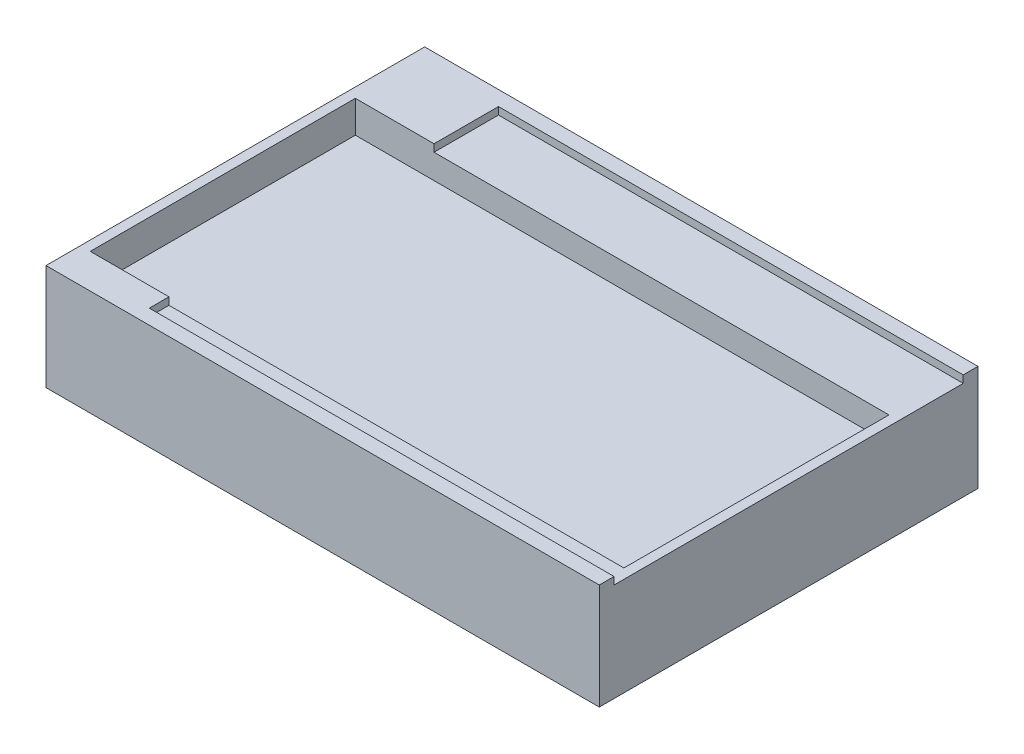
ISO-10303-21;
HEADER;
FILE_DESCRIPTION(('STEP AP214'),'2;1');
FILE_NAME('part.step','',(''),(''),'','','');
FILE_SCHEMA(('AUTOMOTIVE_DESIGN { 1 0 10303 214 1 1 1 1 }'));
ENDSEC;
DATA;
#1=APPLICATION_CONTEXT('core data for automotive mechanical design processes');
#2=APPLICATION_PROTOCOL_DEFINITION('international standard','automotive_design',2000,#1);
#3=PRODUCT_CONTEXT('',#1,'mechanical');
#4=PRODUCT('Part','Part','',(#3));
#5=PRODUCT_RELATED_PRODUCT_CATEGORY('part','',(#4));
#6=PRODUCT_DEFINITION_FORMATION('','',#4);
#7=PRODUCT_DEFINITION_CONTEXT('part definition',#1,'design');
#8=PRODUCT_DEFINITION('design','',#6,#7);
#9=PRODUCT_DEFINITION_SHAPE('','',#8);
#10=(LENGTH_UNIT() NAMED_UNIT(*) SI_UNIT(.MILLI.,.METRE.));
#11=(NAMED_UNIT(*) PLANE_ANGLE_UNIT() SI_UNIT($,.RADIAN.));
#12=(NAMED_UNIT(*) SI_UNIT($,.STERADIAN.) SOLID_ANGLE_UNIT());
#13=UNCERTAINTY_MEASURE_WITH_UNIT(LENGTH_MEASURE(1.E-05),#10,'distance_accuracy_value','');
#14=(GEOMETRIC_REPRESENTATION_CONTEXT(3) GLOBAL_UNCERTAINTY_ASSIGNED_CONTEXT((#13)) GLOBAL_UNIT_ASSIGNED_CONTEXT((#10,
#11,#12)) REPRESENTATION_CONTEXT('',''));
#15=CARTESIAN_POINT('',(0.,0.,0.));
#16=DIRECTION('',(0.,0.,1.));
#17=DIRECTION('',(1.,0.,0.));
#18=AXIS2_PLACEMENT_3D('',#15,#16,#17);
#19=CARTESIAN_POINT('',(0.,1.5,0.));
#20=DIRECTION('',(0.,1.,0.));
#21=DIRECTION('',(0.,0.,1.));
#22=AXIS2_PLACEMENT_3D('',#19,#20,#21);
#23=PLANE('',#22);
#24=DIRECTION('',(0.,0.,-1.));
#25=VECTOR('',#24,1.);
#26=CARTESIAN_POINT('',(-67.,1.5,0.));
#27=LINE('',#26,#25);
#28=CARTESIAN_POINT('',(-67.,1.5,31.5));
#29=VERTEX_POINT('',#28);
#30=CARTESIAN_POINT('',(-67.,1.5,-22.4));
#31=VERTEX_POINT('',#30);
#32=EDGE_CURVE('E233',#29,#31,#27,.T.);
#33=ORIENTED_EDGE('',*,*,#32,.T.);
#34=DIRECTION('',(1.,0.,0.));
#35=VECTOR('',#34,1.);
#36=CARTESIAN_POINT('',(0.,1.5,-22.4));
#37=LINE('',#36,#35);
#38=CARTESIAN_POINT('',(-51.,1.5,-22.4));
#39=VERTEX_POINT('',#38);
#40=EDGE_CURVE('E236',#31,#39,#37,.T.);
#41=ORIENTED_EDGE('',*,*,#40,.T.);
#42=DIRECTION('',(0.,0.,-1.));
#43=VECTOR('',#42,1.);
#44=CARTESIAN_POINT('',(-51.,1.5,-35.5));
#45=LINE('',#44,#43);
#46=CARTESIAN_POINT('',(-51.,1.5,-35.5));
#47=VERTEX_POINT('',#46);
#48=EDGE_CURVE('E121',#39,#47,#45,.T.);
#49=ORIENTED_EDGE('',*,*,#48,.T.);
#50=DIRECTION('',(1.,0.,0.));
#51=VECTOR('',#50,1.);
#52=CARTESIAN_POINT('',(-51.,1.5,-35.5));
#53=LINE('',#52,#51);
#54=CARTESIAN_POINT('',(43.5,1.5,-35.5));
#55=VERTEX_POINT('',#54);
#56=EDGE_CURVE('E120',#47,#55,#53,.T.);
#57=ORIENTED_EDGE('',*,*,#56,.T.);
#58=DIRECTION('',(0.,0.,-1.));
#59=VECTOR('',#58,1.);
#60=CARTESIAN_POINT('',(43.5,1.5,-38.5));
#61=LINE('',#60,#59);
#62=CARTESIAN_POINT('',(43.5,1.5,-38.5));
#63=VERTEX_POINT('',#62);
#64=EDGE_CURVE('E126',#55,#63,#61,.T.);
#65=ORIENTED_EDGE('',*,*,#64,.T.);
#66=DIRECTION('',(-1.,0.,0.));
#67=VECTOR('',#66,1.);
#68=CARTESIAN_POINT('',(41.5,1.5,-38.5));
#69=LINE('',#68,#67);
#70=CARTESIAN_POINT('',(-69.,1.5,-38.5));
#71=VERTEX_POINT('',#70);
#72=EDGE_CURVE('E101',#63,#71,#69,.T.);
#73=ORIENTED_EDGE('',*,*,#72,.T.);
#74=DIRECTION('',(0.,0.,1.));
#75=VECTOR('',#74,1.);
#76=CARTESIAN_POINT('',(-69.,1.5,38.5));
#77=LINE('',#76,#75);
#78=CARTESIAN_POINT('',(-69.,1.5,38.5));
#79=VERTEX_POINT('',#78);
#80=EDGE_CURVE('E98',#71,#79,#77,.T.);
#81=ORIENTED_EDGE('',*,*,#80,.T.);
#82=DIRECTION('',(1.,0.,0.));
#83=VECTOR('',#82,1.);
#84=CARTESIAN_POINT('',(41.5,1.5,38.5));
#85=LINE('',#84,#83);
#86=CARTESIAN_POINT('',(43.5,1.5,38.5));
#87=VERTEX_POINT('',#86);
#88=EDGE_CURVE('E94',#79,#87,#85,.T.);
#89=ORIENTED_EDGE('',*,*,#88,.T.);
#90=CARTESIAN_POINT('',(43.5,1.5,35.5));
#91=VERTEX_POINT('',#90);
#92=EDGE_CURVE('E104',#87,#91,#61,.T.);
#93=ORIENTED_EDGE('',*,*,#92,.T.);
#94=DIRECTION('',(-1.,0.,0.));
#95=VECTOR('',#94,1.);
#96=CARTESIAN_POINT('',(-51.,1.5,35.5));
#97=LINE('',#96,#95);
#98=CARTESIAN_POINT('',(-51.,1.5,35.5));
#99=VERTEX_POINT('',#98);
#100=EDGE_CURVE('E238',#91,#99,#97,.T.);
#101=ORIENTED_EDGE('',*,*,#100,.T.);
#102=CARTESIAN_POINT('',(-51.,1.5,31.5));
#103=VERTEX_POINT('',#102);
#104=EDGE_CURVE('E117',#99,#103,#45,.T.);
#105=ORIENTED_EDGE('',*,*,#104,.T.);
#106=DIRECTION('',(-1.,0.,0.));
#107=VECTOR('',#106,1.);
#108=CARTESIAN_POINT('',(0.,1.5,31.5));
#109=LINE('',#108,#107);
#110=EDGE_CURVE('E226',#103,#29,#109,.T.);
#111=ORIENTED_EDGE('',*,*,#110,.T.);
#112=EDGE_LOOP('',(#33,#41,#49,#57,#65,#73,#81,#89,#93,#101,#105,#111));
#113=FACE_BOUND('',#112,.T.);
#114=ADVANCED_FACE('F33',(#113),#23,.T.);
#115=CARTESIAN_POINT('',(-51.,138.327730121205,-35.5));
#116=DIRECTION('',(-1.,0.,0.));
#117=DIRECTION('',(0.,0.,1.));
#118=AXIS2_PLACEMENT_3D('',#115,#116,#117);
#119=PLANE('',#118);
#120=DIRECTION('',(0.,-1.,0.));
#121=VECTOR('',#120,1.);
#122=CARTESIAN_POINT('',(-51.,1.50005,-22.4));
#123=LINE('',#122,#121);
#124=CARTESIAN_POINT('',(-51.,0.,-22.4));
#125=VERTEX_POINT('',#124);
#126=EDGE_CURVE('E172',#39,#125,#123,.T.);
#127=ORIENTED_EDGE('',*,*,#126,.T.);
#128=DIRECTION('',(0.,0.,-1.));
#129=VECTOR('',#128,1.);
#130=CARTESIAN_POINT('',(-51.,0.,-35.5));
#131=LINE('',#130,#129);
#132=CARTESIAN_POINT('',(-51.,0.,-35.5));
#133=VERTEX_POINT('',#132);
#134=EDGE_CURVE('E168',#125,#133,#131,.T.);
#135=ORIENTED_EDGE('',*,*,#134,.T.);
#136=DIRECTION('',(0.,-1.,0.));
#137=VECTOR('',#136,1.);
#138=CARTESIAN_POINT('',(-51.,138.327730121205,-35.5));
#139=LINE('',#138,#137);
#140=EDGE_CURVE('E135',#47,#133,#139,.T.);
#141=ORIENTED_EDGE('',*,*,#140,.F.);
#142=ORIENTED_EDGE('',*,*,#48,.F.);
#143=EDGE_LOOP('',(#127,#135,#141,#142));
#144=FACE_BOUND('',#143,.T.);
#145=ADVANCED_FACE('F297',(#144),#119,.F.);
#146=DIRECTION('',(0.,-1.,0.));
#147=VECTOR('',#146,1.);
#148=CARTESIAN_POINT('',(-51.,1.50005,31.5));
#149=LINE('',#148,#147);
#150=CARTESIAN_POINT('',(-51.,0.,31.5));
#151=VERTEX_POINT('',#150);
#152=EDGE_CURVE('E223',#103,#151,#149,.T.);
#153=ORIENTED_EDGE('',*,*,#152,.F.);
#154=ORIENTED_EDGE('',*,*,#104,.F.);
#155=DIRECTION('',(0.,-1.,0.));
#156=VECTOR('',#155,1.);
#157=CARTESIAN_POINT('',(-51.,138.327730121205,35.5));
#158=LINE('',#157,#156);
#159=CARTESIAN_POINT('',(-51.,0.,35.5));
#160=VERTEX_POINT('',#159);
#161=EDGE_CURVE('E273',#99,#160,#158,.T.);
#162=ORIENTED_EDGE('',*,*,#161,.T.);
#163=EDGE_CURVE('E141',#160,#151,#131,.T.);
#164=ORIENTED_EDGE('',*,*,#163,.T.);
#165=EDGE_LOOP('',(#153,#154,#162,#164));
#166=FACE_BOUND('',#165,.T.);
#167=ADVANCED_FACE('F292',(#166),#119,.F.);
#168=CARTESIAN_POINT('',(41.5,-20.,38.5));
#169=DIRECTION('',(0.,0.,-1.));
#170=DIRECTION('',(-1.,0.,0.));
#171=AXIS2_PLACEMENT_3D('',#168,#169,#170);
#172=PLANE('',#171);
#173=ORIENTED_EDGE('',*,*,#88,.F.);
#174=DIRECTION('',(0.,1.,0.));
#175=VECTOR('',#174,1.);
#176=CARTESIAN_POINT('',(-69.,-20.,38.5));
#177=LINE('',#176,#175);
#178=CARTESIAN_POINT('',(-69.,-20.,38.5));
#179=VERTEX_POINT('',#178);
#180=EDGE_CURVE('E97',#179,#79,#177,.T.);
#181=ORIENTED_EDGE('',*,*,#180,.F.);
#182=DIRECTION('',(-1.,0.,0.));
#183=VECTOR('',#182,1.);
#184=CARTESIAN_POINT('',(41.5,-20.,38.5));
#185=LINE('',#184,#183);
#186=CARTESIAN_POINT('',(43.5,-20.,38.5));
#187=VERTEX_POINT('',#186);
#188=EDGE_CURVE('E281',#187,#179,#185,.T.);
#189=ORIENTED_EDGE('',*,*,#188,.F.);
#190=DIRECTION('',(0.,1.,0.));
#191=VECTOR('',#190,1.);
#192=CARTESIAN_POINT('',(43.5,-20.,38.5));
#193=LINE('',#192,#191);
#194=EDGE_CURVE('E113',#187,#87,#193,.T.);
#195=ORIENTED_EDGE('',*,*,#194,.T.);
#196=EDGE_LOOP('',(#173,#181,#189,#195));
#197=FACE_BOUND('',#196,.T.);
#198=ADVANCED_FACE('F321',(#197),#172,.F.);
#199=CARTESIAN_POINT('',(-69.,-20.,38.5));
#200=DIRECTION('',(1.,0.,0.));
#201=DIRECTION('',(0.,0.,-1.));
#202=AXIS2_PLACEMENT_3D('',#199,#200,#201);
#203=PLANE('',#202);
#204=ORIENTED_EDGE('',*,*,#80,.F.);
#205=DIRECTION('',(0.,1.,0.));
#206=VECTOR('',#205,1.);
#207=CARTESIAN_POINT('',(-69.,-20.,-38.5));
#208=LINE('',#207,#206);
#209=CARTESIAN_POINT('',(-69.,-20.,-38.5));
#210=VERTEX_POINT('',#209);
#211=EDGE_CURVE('E107',#210,#71,#208,.T.);
#212=ORIENTED_EDGE('',*,*,#211,.F.);
#213=DIRECTION('',(0.,0.,-1.));
#214=VECTOR('',#213,1.);
#215=CARTESIAN_POINT('',(-69.,-20.,38.5));
#216=LINE('',#215,#214);
#217=EDGE_CURVE('E286',#179,#210,#216,.T.);
#218=ORIENTED_EDGE('',*,*,#217,.F.);
#219=ORIENTED_EDGE('',*,*,#180,.T.);
#220=EDGE_LOOP('',(#204,#212,#218,#219));
#221=FACE_BOUND('',#220,.T.);
#222=ADVANCED_FACE('F261',(#221),#203,.F.);
#223=CARTESIAN_POINT('',(41.5,-20.,-38.5));
#224=DIRECTION('',(0.,0.,1.));
#225=DIRECTION('',(1.,0.,0.));
#226=AXIS2_PLACEMENT_3D('',#223,#224,#225);
#227=PLANE('',#226);
#228=ORIENTED_EDGE('',*,*,#72,.F.);
#229=DIRECTION('',(0.,1.,0.));
#230=VECTOR('',#229,1.);
#231=CARTESIAN_POINT('',(43.5,-20.,-38.5));
#232=LINE('',#231,#230);
#233=CARTESIAN_POINT('',(43.5,-20.,-38.5));
#234=VERTEX_POINT('',#233);
#235=EDGE_CURVE('E110',#234,#63,#232,.T.);
#236=ORIENTED_EDGE('',*,*,#235,.F.);
#237=DIRECTION('',(1.,0.,0.));
#238=VECTOR('',#237,1.);
#239=CARTESIAN_POINT('',(41.5,-20.,-38.5));
#240=LINE('',#239,#238);
#241=EDGE_CURVE('E258',#210,#234,#240,.T.);
#242=ORIENTED_EDGE('',*,*,#241,.F.);
#243=ORIENTED_EDGE('',*,*,#211,.T.);
#244=EDGE_LOOP('',(#228,#236,#242,#243));
#245=FACE_BOUND('',#244,.T.);
#246=ADVANCED_FACE('F255',(#245),#227,.F.);
#247=CARTESIAN_POINT('',(43.5,-20.,-38.5));
#248=DIRECTION('',(-1.,0.,0.));
#249=DIRECTION('',(0.,0.,1.));
#250=AXIS2_PLACEMENT_3D('',#247,#248,#249);
#251=PLANE('',#250);
#252=ORIENTED_EDGE('',*,*,#92,.F.);
#253=ORIENTED_EDGE('',*,*,#194,.F.);
#254=DIRECTION('',(0.,0.,1.));
#255=VECTOR('',#254,1.);
#256=CARTESIAN_POINT('',(43.5,-20.,-38.5));
#257=LINE('',#256,#255);
#258=EDGE_CURVE('E116',#234,#187,#257,.T.);
#259=ORIENTED_EDGE('',*,*,#258,.F.);
#260=ORIENTED_EDGE('',*,*,#235,.T.);
#261=ORIENTED_EDGE('',*,*,#64,.F.);
#262=DIRECTION('',(0.,-1.,0.));
#263=VECTOR('',#262,1.);
#264=CARTESIAN_POINT('',(43.5,138.327730121205,-35.5));
#265=LINE('',#264,#263);
#266=CARTESIAN_POINT('',(43.5,0.,-35.5));
#267=VERTEX_POINT('',#266);
#268=EDGE_CURVE('E136',#55,#267,#265,.T.);
#269=ORIENTED_EDGE('',*,*,#268,.T.);
#270=DIRECTION('',(0.,0.,1.));
#271=VECTOR('',#270,1.);
#272=CARTESIAN_POINT('',(43.5,0.,-38.5));
#273=LINE('',#272,#271);
#274=CARTESIAN_POINT('',(43.5,0.,35.5));
#275=VERTEX_POINT('',#274);
#276=EDGE_CURVE('E268',#267,#275,#273,.T.);
#277=ORIENTED_EDGE('',*,*,#276,.T.);
#278=DIRECTION('',(0.,-1.,0.));
#279=VECTOR('',#278,1.);
#280=CARTESIAN_POINT('',(43.5,138.327730121205,35.5));
#281=LINE('',#280,#279);
#282=EDGE_CURVE('E149',#91,#275,#281,.T.);
#283=ORIENTED_EDGE('',*,*,#282,.F.);
#284=EDGE_LOOP('',(#252,#253,#259,#260,#261,#269,#277,#283));
#285=FACE_BOUND('',#284,.T.);
#286=ADVANCED_FACE('F35',(#285),#251,.F.);
#287=CARTESIAN_POINT('',(0.,0.,0.));
#288=DIRECTION('',(0.,-1.,0.));
#289=DIRECTION('',(0.,0.,-1.));
#290=AXIS2_PLACEMENT_3D('',#287,#288,#289);
#291=PLANE('',#290);
#292=DIRECTION('',(0.,0.,-1.));
#293=VECTOR('',#292,1.);
#294=CARTESIAN_POINT('',(41.5,0.,-22.4));
#295=LINE('',#294,#293);
#296=CARTESIAN_POINT('',(41.5,0.,31.5));
#297=VERTEX_POINT('',#296);
#298=CARTESIAN_POINT('',(41.5,0.,-22.4));
#299=VERTEX_POINT('',#298);
#300=EDGE_CURVE('E11',#297,#299,#295,.T.);
#301=ORIENTED_EDGE('',*,*,#300,.F.);
#302=DIRECTION('',(1.,0.,0.));
#303=VECTOR('',#302,1.);
#304=CARTESIAN_POINT('',(41.5,0.,31.5));
#305=LINE('',#304,#303);
#306=EDGE_CURVE('E89',#151,#297,#305,.T.);
#307=ORIENTED_EDGE('',*,*,#306,.F.);
#308=ORIENTED_EDGE('',*,*,#163,.F.);
#309=DIRECTION('',(-1.,0.,0.));
#310=VECTOR('',#309,1.);
#311=CARTESIAN_POINT('',(-51.,0.,35.5));
#312=LINE('',#311,#310);
#313=EDGE_CURVE('E271',#275,#160,#312,.T.);
#314=ORIENTED_EDGE('',*,*,#313,.F.);
#315=ORIENTED_EDGE('',*,*,#276,.F.);
#316=DIRECTION('',(1.,0.,0.));
#317=VECTOR('',#316,1.);
#318=CARTESIAN_POINT('',(-51.,0.,-35.5));
#319=LINE('',#318,#317);
#320=EDGE_CURVE('E131',#133,#267,#319,.T.);
#321=ORIENTED_EDGE('',*,*,#320,.F.);
#322=ORIENTED_EDGE('',*,*,#134,.F.);
#323=DIRECTION('',(-1.,0.,0.));
#324=VECTOR('',#323,1.);
#325=CARTESIAN_POINT('',(41.5,0.,-22.4));
#326=LINE('',#325,#324);
#327=EDGE_CURVE('E43',#299,#125,#326,.T.);
#328=ORIENTED_EDGE('',*,*,#327,.F.);
#329=EDGE_LOOP('',(#301,#307,#308,#314,#315,#321,#322,#328));
#330=FACE_BOUND('',#329,.T.);
#331=ADVANCED_FACE('F161',(#330),#291,.F.);
#332=CARTESIAN_POINT('',(0.,-20.,0.));
#333=DIRECTION('',(0.,-1.,0.));
#334=DIRECTION('',(0.,0.,-1.));
#335=AXIS2_PLACEMENT_3D('',#332,#333,#334);
#336=PLANE('',#335);
#337=ORIENTED_EDGE('',*,*,#188,.T.);
#338=ORIENTED_EDGE('',*,*,#217,.T.);
#339=ORIENTED_EDGE('',*,*,#241,.T.);
#340=ORIENTED_EDGE('',*,*,#258,.T.);
#341=EDGE_LOOP('',(#337,#338,#339,#340));
#342=FACE_BOUND('',#341,.T.);
#343=ADVANCED_FACE('F307',(#342),#336,.T.);
#344=CARTESIAN_POINT('',(-51.,138.327730121205,35.5));
#345=DIRECTION('',(0.,0.,1.));
#346=DIRECTION('',(1.,0.,0.));
#347=AXIS2_PLACEMENT_3D('',#344,#345,#346);
#348=PLANE('',#347);
#349=ORIENTED_EDGE('',*,*,#100,.F.);
#350=ORIENTED_EDGE('',*,*,#282,.T.);
#351=ORIENTED_EDGE('',*,*,#313,.T.);
#352=ORIENTED_EDGE('',*,*,#161,.F.);
#353=EDGE_LOOP('',(#349,#350,#351,#352));
#354=FACE_BOUND('',#353,.T.);
#355=ADVANCED_FACE('F293',(#354),#348,.F.);
#356=CARTESIAN_POINT('',(-51.,138.327730121205,-35.5));
#357=DIRECTION('',(0.,0.,-1.));
#358=DIRECTION('',(-1.,0.,0.));
#359=AXIS2_PLACEMENT_3D('',#356,#357,#358);
#360=PLANE('',#359);
#361=ORIENTED_EDGE('',*,*,#56,.F.);
#362=ORIENTED_EDGE('',*,*,#140,.T.);
#363=ORIENTED_EDGE('',*,*,#320,.T.);
#364=ORIENTED_EDGE('',*,*,#268,.F.);
#365=EDGE_LOOP('',(#361,#362,#363,#364));
#366=FACE_BOUND('',#365,.T.);
#367=ADVANCED_FACE('F299',(#366),#360,.F.);
#368=CARTESIAN_POINT('',(41.5,-5.,-22.4));
#369=DIRECTION('',(1.,0.,0.));
#370=DIRECTION('',(0.,0.,-1.));
#371=AXIS2_PLACEMENT_3D('',#368,#369,#370);
#372=PLANE('',#371);
#373=ORIENTED_EDGE('',*,*,#300,.T.);
#374=DIRECTION('',(0.,1.,0.));
#375=VECTOR('',#374,1.);
#376=CARTESIAN_POINT('',(41.5,-5.,-22.4));
#377=LINE('',#376,#375);
#378=CARTESIAN_POINT('',(41.5,-5.,-22.4));
#379=VERTEX_POINT('',#378);
#380=EDGE_CURVE('E52',#379,#299,#377,.T.);
#381=ORIENTED_EDGE('',*,*,#380,.F.);
#382=DIRECTION('',(0.,0.,-1.));
#383=VECTOR('',#382,1.);
#384=CARTESIAN_POINT('',(41.5,-5.,-22.4));
#385=LINE('',#384,#383);
#386=CARTESIAN_POINT('',(41.5,-5.,31.5));
#387=VERTEX_POINT('',#386);
#388=EDGE_CURVE('E74',#387,#379,#385,.T.);
#389=ORIENTED_EDGE('',*,*,#388,.F.);
#390=DIRECTION('',(0.,1.,0.));
#391=VECTOR('',#390,1.);
#392=CARTESIAN_POINT('',(41.5,-5.,31.5));
#393=LINE('',#392,#391);
#394=EDGE_CURVE('E148',#387,#297,#393,.T.);
#395=ORIENTED_EDGE('',*,*,#394,.T.);
#396=EDGE_LOOP('',(#373,#381,#389,#395));
#397=FACE_BOUND('',#396,.T.);
#398=ADVANCED_FACE('F72',(#397),#372,.F.);
#399=CARTESIAN_POINT('',(41.5,-5.,31.5));
#400=DIRECTION('',(0.,0.,1.));
#401=DIRECTION('',(1.,0.,0.));
#402=AXIS2_PLACEMENT_3D('',#399,#400,#401);
#403=PLANE('',#402);
#404=DIRECTION('',(0.,1.,0.));
#405=VECTOR('',#404,1.);
#406=CARTESIAN_POINT('',(-67.,-5.,31.5));
#407=LINE('',#406,#405);
#408=CARTESIAN_POINT('',(-67.,-5.,31.5));
#409=VERTEX_POINT('',#408);
#410=EDGE_CURVE('E145',#409,#29,#407,.T.);
#411=ORIENTED_EDGE('',*,*,#410,.T.);
#412=ORIENTED_EDGE('',*,*,#110,.F.);
#413=ORIENTED_EDGE('',*,*,#152,.T.);
#414=ORIENTED_EDGE('',*,*,#306,.T.);
#415=ORIENTED_EDGE('',*,*,#394,.F.);
#416=DIRECTION('',(1.,0.,0.));
#417=VECTOR('',#416,1.);
#418=CARTESIAN_POINT('',(41.5,-5.,31.5));
#419=LINE('',#418,#417);
#420=EDGE_CURVE('E77',#409,#387,#419,.T.);
#421=ORIENTED_EDGE('',*,*,#420,.F.);
#422=EDGE_LOOP('',(#411,#412,#413,#414,#415,#421));
#423=FACE_BOUND('',#422,.T.);
#424=ADVANCED_FACE('F154',(#423),#403,.F.);
#425=CARTESIAN_POINT('',(-67.,-5.,-22.4));
#426=DIRECTION('',(-1.,0.,0.));
#427=DIRECTION('',(0.,0.,1.));
#428=AXIS2_PLACEMENT_3D('',#425,#426,#427);
#429=PLANE('',#428);
#430=DIRECTION('',(0.,1.,0.));
#431=VECTOR('',#430,1.);
#432=CARTESIAN_POINT('',(-67.,-5.,-22.4));
#433=LINE('',#432,#431);
#434=CARTESIAN_POINT('',(-67.,-5.,-22.4));
#435=VERTEX_POINT('',#434);
#436=EDGE_CURVE('E78',#435,#31,#433,.T.);
#437=ORIENTED_EDGE('',*,*,#436,.T.);
#438=ORIENTED_EDGE('',*,*,#32,.F.);
#439=ORIENTED_EDGE('',*,*,#410,.F.);
#440=DIRECTION('',(0.,0.,1.));
#441=VECTOR('',#440,1.);
#442=CARTESIAN_POINT('',(-67.,-5.,-22.4));
#443=LINE('',#442,#441);
#444=EDGE_CURVE('E84',#435,#409,#443,.T.);
#445=ORIENTED_EDGE('',*,*,#444,.F.);
#446=EDGE_LOOP('',(#437,#438,#439,#445));
#447=FACE_BOUND('',#446,.T.);
#448=ADVANCED_FACE('F296',(#447),#429,.F.);
#449=CARTESIAN_POINT('',(41.5,-5.,-22.4));
#450=DIRECTION('',(0.,0.,-1.));
#451=DIRECTION('',(-1.,0.,0.));
#452=AXIS2_PLACEMENT_3D('',#449,#450,#451);
#453=PLANE('',#452);
#454=ORIENTED_EDGE('',*,*,#436,.F.);
#455=DIRECTION('',(-1.,0.,0.));
#456=VECTOR('',#455,1.);
#457=CARTESIAN_POINT('',(41.5,-5.,-22.4));
#458=LINE('',#457,#456);
#459=EDGE_CURVE('E68',#379,#435,#458,.T.);
#460=ORIENTED_EDGE('',*,*,#459,.F.);
#461=ORIENTED_EDGE('',*,*,#380,.T.);
#462=ORIENTED_EDGE('',*,*,#327,.T.);
#463=ORIENTED_EDGE('',*,*,#126,.F.);
#464=ORIENTED_EDGE('',*,*,#40,.F.);
#465=EDGE_LOOP('',(#454,#460,#461,#462,#463,#464));
#466=FACE_BOUND('',#465,.T.);
#467=ADVANCED_FACE('F80',(#466),#453,.F.);
#468=CARTESIAN_POINT('',(0.,-5.,0.));
#469=DIRECTION('',(0.,-1.,0.));
#470=DIRECTION('',(0.,0.,-1.));
#471=AXIS2_PLACEMENT_3D('',#468,#469,#470);
#472=PLANE('',#471);
#473=ORIENTED_EDGE('',*,*,#420,.T.);
#474=ORIENTED_EDGE('',*,*,#388,.T.);
#475=ORIENTED_EDGE('',*,*,#459,.T.);
#476=ORIENTED_EDGE('',*,*,#444,.T.);
#477=EDGE_LOOP('',(#473,#474,#475,#476));
#478=FACE_BOUND('',#477,.T.);
#479=ADVANCED_FACE('F86',(#478),#472,.F.);
#480=CLOSED_SHELL('',(#114,#145,#167,#198,#222,#246,#286,#331,#343,#355,#367,#398,#424,#448,
#467,#479));
#481=MANIFOLD_SOLID_BREP('B2',#480);
#482=ADVANCED_BREP_SHAPE_REPRESENTATION('',(#18,#481),#14);
#483=SHAPE_DEFINITION_REPRESENTATION(#9,#482);
ENDSEC;
END-ISO-10303-21;
